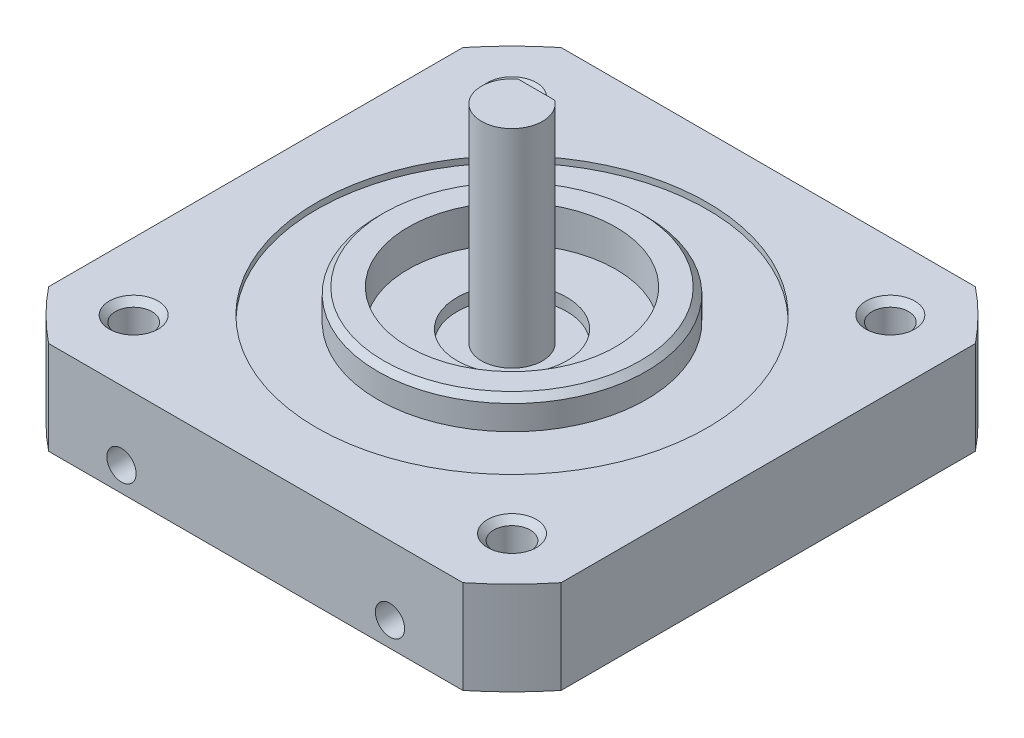
ISO-10303-21;
HEADER;
FILE_DESCRIPTION(('STEP AP214'),'2;1');
FILE_NAME('part.step','',(''),(''),'','','');
FILE_SCHEMA(('AUTOMOTIVE_DESIGN { 1 0 10303 214 1 1 1 1 }'));
ENDSEC;
DATA;
#1=APPLICATION_CONTEXT('core data for automotive mechanical design processes');
#2=APPLICATION_PROTOCOL_DEFINITION('international standard','automotive_design',2000,#1);
#3=PRODUCT_CONTEXT('',#1,'mechanical');
#4=PRODUCT('Part','Part','',(#3));
#5=PRODUCT_RELATED_PRODUCT_CATEGORY('part','',(#4));
#6=PRODUCT_DEFINITION_FORMATION('','',#4);
#7=PRODUCT_DEFINITION_CONTEXT('part definition',#1,'design');
#8=PRODUCT_DEFINITION('design','',#6,#7);
#9=PRODUCT_DEFINITION_SHAPE('','',#8);
#10=(LENGTH_UNIT() NAMED_UNIT(*) SI_UNIT(.MILLI.,.METRE.));
#11=(NAMED_UNIT(*) PLANE_ANGLE_UNIT() SI_UNIT($,.RADIAN.));
#12=(NAMED_UNIT(*) SI_UNIT($,.STERADIAN.) SOLID_ANGLE_UNIT());
#13=UNCERTAINTY_MEASURE_WITH_UNIT(LENGTH_MEASURE(1.E-05),#10,'distance_accuracy_value','');
#14=(GEOMETRIC_REPRESENTATION_CONTEXT(3) GLOBAL_UNCERTAINTY_ASSIGNED_CONTEXT((#13)) GLOBAL_UNIT_ASSIGNED_CONTEXT((#10,
#11,#12)) REPRESENTATION_CONTEXT('',''));
#15=CARTESIAN_POINT('',(0.,0.,0.));
#16=DIRECTION('',(0.,0.,1.));
#17=DIRECTION('',(1.,0.,0.));
#18=AXIS2_PLACEMENT_3D('',#15,#16,#17);
#19=CARTESIAN_POINT('',(17.6499999997864,29.3,17.65));
#20=DIRECTION('',(0.,1.,0.));
#21=DIRECTION('',(0.,0.,1.));
#22=AXIS2_PLACEMENT_3D('',#19,#20,#21);
#23=CYLINDRICAL_SURFACE('',#22,2.50000000020422);
#24=DIRECTION('',(0.,1.,0.));
#25=VECTOR('',#24,1.);
#26=CARTESIAN_POINT('',(19.1500000003991,40.3,15.6500000002042));
#27=LINE('',#26,#25);
#28=CARTESIAN_POINT('',(19.1500000003991,40.3,15.6500000002042));
#29=VERTEX_POINT('',#28);
#30=CARTESIAN_POINT('',(19.1500000003991,49.3,15.6500000002042));
#31=VERTEX_POINT('',#30);
#32=EDGE_CURVE('E123',#29,#31,#27,.T.);
#33=ORIENTED_EDGE('',*,*,#32,.T.);
#34=CARTESIAN_POINT('',(17.6499999997864,49.3,17.65));
#35=DIRECTION('',(0.,1.,0.));
#36=DIRECTION('',(0.,0.,1.));
#37=AXIS2_PLACEMENT_3D('',#34,#35,#36);
#38=CIRCLE('',#37,2.50000000020422);
#39=CARTESIAN_POINT('',(16.1499999991738,49.3,15.6500000002042));
#40=VERTEX_POINT('',#39);
#41=EDGE_CURVE('E139',#40,#31,#38,.T.);
#42=ORIENTED_EDGE('',*,*,#41,.F.);
#43=DIRECTION('',(0.,1.,0.));
#44=VECTOR('',#43,1.);
#45=CARTESIAN_POINT('',(16.1499999991738,40.3,15.6500000002042));
#46=LINE('',#45,#44);
#47=CARTESIAN_POINT('',(16.1499999991738,40.3,15.6500000002042));
#48=VERTEX_POINT('',#47);
#49=EDGE_CURVE('E58',#48,#40,#46,.T.);
#50=ORIENTED_EDGE('',*,*,#49,.F.);
#51=CARTESIAN_POINT('',(17.6499999997864,40.3,17.65));
#52=DIRECTION('',(0.,1.,0.));
#53=DIRECTION('',(0.,0.,1.));
#54=AXIS2_PLACEMENT_3D('',#51,#52,#53);
#55=CIRCLE('',#54,2.50000000020422);
#56=EDGE_CURVE('E129',#29,#48,#55,.T.);
#57=ORIENTED_EDGE('',*,*,#56,.F.);
#58=EDGE_LOOP('',(#33,#42,#50,#57));
#59=FACE_BOUND('',#58,.T.);
#60=CARTESIAN_POINT('',(17.6499999997864,32.3,17.65));
#61=DIRECTION('',(0.,1.,0.));
#62=DIRECTION('',(0.,0.,1.));
#63=AXIS2_PLACEMENT_3D('',#60,#61,#62);
#64=CIRCLE('',#63,2.50000000020422);
#65=CARTESIAN_POINT('',(17.6499999997864,32.3,20.1500000002042));
#66=VERTEX_POINT('',#65);
#67=EDGE_CURVE('E45',#66,#66,#64,.F.);
#68=ORIENTED_EDGE('',*,*,#67,.F.);
#69=EDGE_LOOP('',(#68));
#70=FACE_BOUND('',#69,.T.);
#71=ADVANCED_FACE('F42',(#59,#70),#23,.T.);
#72=CARTESIAN_POINT('',(17.6499999997864,32.3,17.65));
#73=DIRECTION('',(0.,1.,0.));
#74=DIRECTION('',(0.,0.,1.));
#75=AXIS2_PLACEMENT_3D('',#72,#73,#74);
#76=PLANE('',#75);
#77=CARTESIAN_POINT('',(17.6499999997864,32.3,17.65));
#78=DIRECTION('',(0.,1.,0.));
#79=DIRECTION('',(0.,0.,1.));
#80=AXIS2_PLACEMENT_3D('',#77,#78,#79);
#81=CIRCLE('',#80,4.5);
#82=CARTESIAN_POINT('',(17.6499999997864,32.3,22.15));
#83=VERTEX_POINT('',#82);
#84=EDGE_CURVE('E144',#83,#83,#81,.T.);
#85=ORIENTED_EDGE('',*,*,#84,.T.);
#86=EDGE_LOOP('',(#85));
#87=FACE_BOUND('',#86,.T.);
#88=ORIENTED_EDGE('',*,*,#67,.T.);
#89=EDGE_LOOP('',(#88));
#90=FACE_BOUND('',#89,.T.);
#91=ADVANCED_FACE('F265',(#87,#90),#76,.T.);
#92=CARTESIAN_POINT('',(17.6499999997864,32.3,17.65));
#93=DIRECTION('',(0.,1.,0.));
#94=DIRECTION('',(0.,0.,1.));
#95=AXIS2_PLACEMENT_3D('',#92,#93,#94);
#96=CYLINDRICAL_SURFACE('',#95,4.5);
#97=ORIENTED_EDGE('',*,*,#84,.F.);
#98=EDGE_LOOP('',(#97));
#99=FACE_BOUND('',#98,.T.);
#100=CARTESIAN_POINT('',(17.6499999997864,33.31,17.65));
#101=DIRECTION('',(0.,1.,0.));
#102=DIRECTION('',(0.,0.,1.));
#103=AXIS2_PLACEMENT_3D('',#100,#101,#102);
#104=CIRCLE('',#103,4.5);
#105=CARTESIAN_POINT('',(17.6499999997864,33.31,22.15));
#106=VERTEX_POINT('',#105);
#107=EDGE_CURVE('E260',#106,#106,#104,.F.);
#108=ORIENTED_EDGE('',*,*,#107,.F.);
#109=EDGE_LOOP('',(#108));
#110=FACE_BOUND('',#109,.T.);
#111=ADVANCED_FACE('F268',(#99,#110),#96,.F.);
#112=CARTESIAN_POINT('',(17.6499999997864,33.31,17.65));
#113=DIRECTION('',(0.,1.,0.));
#114=DIRECTION('',(0.,0.,1.));
#115=AXIS2_PLACEMENT_3D('',#112,#113,#114);
#116=PLANE('',#115);
#117=ORIENTED_EDGE('',*,*,#107,.T.);
#118=EDGE_LOOP('',(#117));
#119=FACE_BOUND('',#118,.T.);
#120=CARTESIAN_POINT('',(17.6499999997864,33.31,17.65));
#121=DIRECTION('',(0.,1.,0.));
#122=DIRECTION('',(0.,0.,1.));
#123=AXIS2_PLACEMENT_3D('',#120,#121,#122);
#124=CIRCLE('',#123,8.5);
#125=CARTESIAN_POINT('',(17.6499999997864,33.31,26.15));
#126=VERTEX_POINT('',#125);
#127=EDGE_CURVE('E257',#126,#126,#124,.T.);
#128=ORIENTED_EDGE('',*,*,#127,.T.);
#129=EDGE_LOOP('',(#128));
#130=FACE_BOUND('',#129,.T.);
#131=ADVANCED_FACE('F271',(#119,#130),#116,.T.);
#132=CARTESIAN_POINT('',(17.6499999997864,33.31,17.65));
#133=DIRECTION('',(0.,1.,0.));
#134=DIRECTION('',(0.,0.,1.));
#135=AXIS2_PLACEMENT_3D('',#132,#133,#134);
#136=CYLINDRICAL_SURFACE('',#135,8.5);
#137=CARTESIAN_POINT('',(17.6499999997864,36.3,17.65));
#138=DIRECTION('',(0.,1.,0.));
#139=DIRECTION('',(0.,0.,1.));
#140=AXIS2_PLACEMENT_3D('',#137,#138,#139);
#141=CIRCLE('',#140,8.5);
#142=CARTESIAN_POINT('',(17.6499999997864,36.3,26.15));
#143=VERTEX_POINT('',#142);
#144=EDGE_CURVE('E254',#143,#143,#141,.F.);
#145=ORIENTED_EDGE('',*,*,#144,.F.);
#146=EDGE_LOOP('',(#145));
#147=FACE_BOUND('',#146,.T.);
#148=ORIENTED_EDGE('',*,*,#127,.F.);
#149=EDGE_LOOP('',(#148));
#150=FACE_BOUND('',#149,.T.);
#151=ADVANCED_FACE('F277',(#147,#150),#136,.F.);
#152=CARTESIAN_POINT('',(17.6499999997864,36.3,17.65));
#153=DIRECTION('',(0.,1.,0.));
#154=DIRECTION('',(0.,0.,1.));
#155=AXIS2_PLACEMENT_3D('',#152,#153,#154);
#156=PLANE('',#155);
#157=ORIENTED_EDGE('',*,*,#144,.T.);
#158=EDGE_LOOP('',(#157));
#159=FACE_BOUND('',#158,.T.);
#160=CARTESIAN_POINT('',(17.6499999997864,36.3,17.65));
#161=DIRECTION('',(0.,-1.,0.));
#162=DIRECTION('',(0.,0.,-1.));
#163=AXIS2_PLACEMENT_3D('',#160,#161,#162);
#164=CIRCLE('',#163,10.5000000002042);
#165=CARTESIAN_POINT('',(17.6499999997864,36.3,7.14999999979579));
#166=VERTEX_POINT('',#165);
#167=EDGE_CURVE('E209',#166,#166,#164,.T.);
#168=ORIENTED_EDGE('',*,*,#167,.F.);
#169=EDGE_LOOP('',(#168));
#170=FACE_BOUND('',#169,.T.);
#171=ADVANCED_FACE('F282',(#159,#170),#156,.T.);
#172=CARTESIAN_POINT('',(17.6499999997864,35.8,17.65));
#173=DIRECTION('',(0.,-1.,0.));
#174=DIRECTION('',(0.,0.,-1.));
#175=AXIS2_PLACEMENT_3D('',#172,#173,#174);
#176=CONICAL_SURFACE('',#175,11.0000000002042,0.785398163397455);
#177=CARTESIAN_POINT('',(17.6499999997864,35.8,17.65));
#178=DIRECTION('',(0.,-1.,0.));
#179=DIRECTION('',(0.,0.,-1.));
#180=AXIS2_PLACEMENT_3D('',#177,#178,#179);
#181=CIRCLE('',#180,11.0000000002042);
#182=CARTESIAN_POINT('',(17.6499999997864,35.8,6.64999999979577));
#183=VERTEX_POINT('',#182);
#184=EDGE_CURVE('E206',#183,#183,#181,.T.);
#185=ORIENTED_EDGE('',*,*,#184,.F.);
#186=EDGE_LOOP('',(#185));
#187=FACE_BOUND('',#186,.T.);
#188=ORIENTED_EDGE('',*,*,#167,.T.);
#189=EDGE_LOOP('',(#188));
#190=FACE_BOUND('',#189,.T.);
#191=ADVANCED_FACE('F288',(#187,#190),#176,.T.);
#192=CARTESIAN_POINT('',(17.6499999997864,36.3,17.65));
#193=DIRECTION('',(0.,-1.,0.));
#194=DIRECTION('',(0.,0.,-1.));
#195=AXIS2_PLACEMENT_3D('',#192,#193,#194);
#196=CYLINDRICAL_SURFACE('',#195,11.0000000002042);
#197=CARTESIAN_POINT('',(17.6499999997864,33.8,17.65));
#198=DIRECTION('',(0.,-1.,0.));
#199=DIRECTION('',(0.,0.,-1.));
#200=AXIS2_PLACEMENT_3D('',#197,#198,#199);
#201=CIRCLE('',#200,11.0000000002042);
#202=CARTESIAN_POINT('',(17.6499999997864,33.8,6.64999999979577));
#203=VERTEX_POINT('',#202);
#204=EDGE_CURVE('E208',#203,#203,#201,.T.);
#205=ORIENTED_EDGE('',*,*,#204,.F.);
#206=EDGE_LOOP('',(#205));
#207=FACE_BOUND('',#206,.T.);
#208=ORIENTED_EDGE('',*,*,#184,.T.);
#209=EDGE_LOOP('',(#208));
#210=FACE_BOUND('',#209,.T.);
#211=ADVANCED_FACE('F396',(#207,#210),#196,.T.);
#212=CARTESIAN_POINT('',(2.14999999978644,29.8,33.15));
#213=DIRECTION('',(0.,-1.,0.));
#214=DIRECTION('',(0.,0.,-1.));
#215=AXIS2_PLACEMENT_3D('',#212,#213,#214);
#216=PLANE('',#215);
#217=CARTESIAN_POINT('',(2.14999999978644,29.8,33.15));
#218=DIRECTION('',(0.,1.,0.));
#219=DIRECTION('',(0.,0.,1.));
#220=AXIS2_PLACEMENT_3D('',#217,#218,#219);
#221=CIRCLE('',#220,1.5);
#222=CARTESIAN_POINT('',(2.14999999978644,29.8,34.65));
#223=VERTEX_POINT('',#222);
#224=EDGE_CURVE('E247',#223,#223,#221,.T.);
#225=ORIENTED_EDGE('',*,*,#224,.T.);
#226=EDGE_LOOP('',(#225));
#227=FACE_BOUND('',#226,.T.);
#228=ADVANCED_FACE('F392',(#227),#216,.F.);
#229=CARTESIAN_POINT('',(33.1499999997864,29.8,33.15));
#230=DIRECTION('',(0.,1.,0.));
#231=DIRECTION('',(0.,0.,1.));
#232=AXIS2_PLACEMENT_3D('',#229,#230,#231);
#233=PLANE('',#232);
#234=CARTESIAN_POINT('',(33.1499999997864,29.8,33.15));
#235=DIRECTION('',(0.,1.,0.));
#236=DIRECTION('',(0.,0.,1.));
#237=AXIS2_PLACEMENT_3D('',#234,#235,#236);
#238=CIRCLE('',#237,1.5);
#239=CARTESIAN_POINT('',(33.1499999997864,29.8,34.65));
#240=VERTEX_POINT('',#239);
#241=EDGE_CURVE('E244',#240,#240,#238,.T.);
#242=ORIENTED_EDGE('',*,*,#241,.T.);
#243=EDGE_LOOP('',(#242));
#244=FACE_BOUND('',#243,.T.);
#245=ADVANCED_FACE('F388',(#244),#233,.T.);
#246=CARTESIAN_POINT('',(33.1499999997864,29.8,2.15));
#247=DIRECTION('',(0.,-1.,0.));
#248=DIRECTION('',(0.,0.,-1.));
#249=AXIS2_PLACEMENT_3D('',#246,#247,#248);
#250=PLANE('',#249);
#251=CARTESIAN_POINT('',(33.1499999997864,29.8,2.15));
#252=DIRECTION('',(0.,1.,0.));
#253=DIRECTION('',(0.,0.,1.));
#254=AXIS2_PLACEMENT_3D('',#251,#252,#253);
#255=CIRCLE('',#254,1.5);
#256=CARTESIAN_POINT('',(33.1499999997864,29.8,3.65));
#257=VERTEX_POINT('',#256);
#258=EDGE_CURVE('E241',#257,#257,#255,.T.);
#259=ORIENTED_EDGE('',*,*,#258,.T.);
#260=EDGE_LOOP('',(#259));
#261=FACE_BOUND('',#260,.T.);
#262=ADVANCED_FACE('F384',(#261),#250,.F.);
#263=CARTESIAN_POINT('',(2.14999999978644,29.8,2.15));
#264=DIRECTION('',(0.,1.,0.));
#265=DIRECTION('',(0.,0.,1.));
#266=AXIS2_PLACEMENT_3D('',#263,#264,#265);
#267=PLANE('',#266);
#268=CARTESIAN_POINT('',(2.14999999978644,29.8,2.15));
#269=DIRECTION('',(0.,1.,0.));
#270=DIRECTION('',(0.,0.,1.));
#271=AXIS2_PLACEMENT_3D('',#268,#269,#270);
#272=CIRCLE('',#271,1.5);
#273=CARTESIAN_POINT('',(2.14999999978644,29.8,3.65));
#274=VERTEX_POINT('',#273);
#275=EDGE_CURVE('E238',#274,#274,#272,.T.);
#276=ORIENTED_EDGE('',*,*,#275,.T.);
#277=EDGE_LOOP('',(#276));
#278=FACE_BOUND('',#277,.T.);
#279=ADVANCED_FACE('F380',(#278),#267,.T.);
#280=CARTESIAN_POINT('',(17.6499999997864,33.8,17.65));
#281=DIRECTION('',(0.,1.,0.));
#282=DIRECTION('',(0.,0.,1.));
#283=AXIS2_PLACEMENT_3D('',#280,#281,#282);
#284=PLANE('',#283);
#285=CARTESIAN_POINT('',(17.6499999997864,33.8,17.65));
#286=DIRECTION('',(0.,1.,0.));
#287=DIRECTION('',(0.,0.,1.));
#288=AXIS2_PLACEMENT_3D('',#285,#286,#287);
#289=CIRCLE('',#288,16.);
#290=CARTESIAN_POINT('',(17.6499999997864,33.8,33.65));
#291=VERTEX_POINT('',#290);
#292=EDGE_CURVE('E205',#291,#291,#289,.T.);
#293=ORIENTED_EDGE('',*,*,#292,.T.);
#294=EDGE_LOOP('',(#293));
#295=FACE_BOUND('',#294,.T.);
#296=ORIENTED_EDGE('',*,*,#204,.T.);
#297=EDGE_LOOP('',(#296));
#298=FACE_BOUND('',#297,.T.);
#299=ADVANCED_FACE('F376',(#295,#298),#284,.T.);
#300=CARTESIAN_POINT('',(2.14999999978644,29.8,33.15));
#301=DIRECTION('',(0.,1.,0.));
#302=DIRECTION('',(0.,0.,1.));
#303=AXIS2_PLACEMENT_3D('',#300,#301,#302);
#304=CYLINDRICAL_SURFACE('',#303,1.5);
#305=ORIENTED_EDGE('',*,*,#224,.F.);
#306=EDGE_LOOP('',(#305));
#307=FACE_BOUND('',#306,.T.);
#308=CARTESIAN_POINT('',(2.14999999978644,33.7999999999852,33.15));
#309=DIRECTION('',(0.,1.,0.));
#310=DIRECTION('',(0.,0.,1.));
#311=AXIS2_PLACEMENT_3D('',#308,#309,#310);
#312=CIRCLE('',#311,1.49999999999918);
#313=CARTESIAN_POINT('',(2.14999999978644,33.7999999999852,34.6499999999992));
#314=VERTEX_POINT('',#313);
#315=EDGE_CURVE('E202',#314,#314,#312,.T.);
#316=ORIENTED_EDGE('',*,*,#315,.T.);
#317=EDGE_LOOP('',(#316));
#318=FACE_BOUND('',#317,.T.);
#319=ADVANCED_FACE('F372',(#307,#318),#304,.F.);
#320=CARTESIAN_POINT('',(33.1499999997864,29.8,33.15));
#321=DIRECTION('',(0.,1.,0.));
#322=DIRECTION('',(0.,0.,1.));
#323=AXIS2_PLACEMENT_3D('',#320,#321,#322);
#324=CYLINDRICAL_SURFACE('',#323,1.5);
#325=ORIENTED_EDGE('',*,*,#241,.F.);
#326=EDGE_LOOP('',(#325));
#327=FACE_BOUND('',#326,.T.);
#328=CARTESIAN_POINT('',(33.1499999997864,33.7999999999852,33.15));
#329=DIRECTION('',(0.,1.,0.));
#330=DIRECTION('',(0.,0.,1.));
#331=AXIS2_PLACEMENT_3D('',#328,#329,#330);
#332=CIRCLE('',#331,1.49999999999918);
#333=CARTESIAN_POINT('',(33.1499999997864,33.7999999999852,34.6499999999992));
#334=VERTEX_POINT('',#333);
#335=EDGE_CURVE('E199',#334,#334,#332,.T.);
#336=ORIENTED_EDGE('',*,*,#335,.T.);
#337=EDGE_LOOP('',(#336));
#338=FACE_BOUND('',#337,.T.);
#339=ADVANCED_FACE('F368',(#327,#338),#324,.F.);
#340=CARTESIAN_POINT('',(33.1499999997864,29.8,2.15));
#341=DIRECTION('',(0.,1.,0.));
#342=DIRECTION('',(0.,0.,1.));
#343=AXIS2_PLACEMENT_3D('',#340,#341,#342);
#344=CYLINDRICAL_SURFACE('',#343,1.5);
#345=ORIENTED_EDGE('',*,*,#258,.F.);
#346=EDGE_LOOP('',(#345));
#347=FACE_BOUND('',#346,.T.);
#348=CARTESIAN_POINT('',(33.1499999997864,33.800000000042,2.15));
#349=DIRECTION('',(0.,1.,0.));
#350=DIRECTION('',(0.,0.,1.));
#351=AXIS2_PLACEMENT_3D('',#348,#349,#350);
#352=CIRCLE('',#351,1.49999999999327);
#353=CARTESIAN_POINT('',(33.1499999997864,33.800000000042,3.64999999999327));
#354=VERTEX_POINT('',#353);
#355=EDGE_CURVE('E196',#354,#354,#352,.T.);
#356=ORIENTED_EDGE('',*,*,#355,.T.);
#357=EDGE_LOOP('',(#356));
#358=FACE_BOUND('',#357,.T.);
#359=ADVANCED_FACE('F364',(#347,#358),#344,.F.);
#360=CARTESIAN_POINT('',(2.14999999978644,29.8,2.15));
#361=DIRECTION('',(0.,1.,0.));
#362=DIRECTION('',(0.,0.,1.));
#363=AXIS2_PLACEMENT_3D('',#360,#361,#362);
#364=CYLINDRICAL_SURFACE('',#363,1.5);
#365=ORIENTED_EDGE('',*,*,#275,.F.);
#366=EDGE_LOOP('',(#365));
#367=FACE_BOUND('',#366,.T.);
#368=CARTESIAN_POINT('',(2.14999999978644,33.7999999999852,2.15));
#369=DIRECTION('',(0.,1.,0.));
#370=DIRECTION('',(0.,0.,1.));
#371=AXIS2_PLACEMENT_3D('',#368,#369,#370);
#372=CIRCLE('',#371,1.49999999999327);
#373=CARTESIAN_POINT('',(2.14999999978644,33.7999999999852,3.64999999999327));
#374=VERTEX_POINT('',#373);
#375=EDGE_CURVE('E192',#374,#374,#372,.T.);
#376=ORIENTED_EDGE('',*,*,#375,.T.);
#377=EDGE_LOOP('',(#376));
#378=FACE_BOUND('',#377,.T.);
#379=ADVANCED_FACE('F360',(#367,#378),#364,.F.);
#380=CARTESIAN_POINT('',(17.6499999997864,33.8,17.65));
#381=DIRECTION('',(0.,1.,0.));
#382=DIRECTION('',(0.,0.,1.));
#383=AXIS2_PLACEMENT_3D('',#380,#381,#382);
#384=CYLINDRICAL_SURFACE('',#383,16.);
#385=CARTESIAN_POINT('',(17.6499999997864,34.3,17.65));
#386=DIRECTION('',(0.,1.,0.));
#387=DIRECTION('',(0.,0.,1.));
#388=AXIS2_PLACEMENT_3D('',#385,#386,#387);
#389=CIRCLE('',#388,16.);
#390=CARTESIAN_POINT('',(17.6499999997864,34.3,33.65));
#391=VERTEX_POINT('',#390);
#392=EDGE_CURVE('E195',#391,#391,#389,.F.);
#393=ORIENTED_EDGE('',*,*,#392,.F.);
#394=EDGE_LOOP('',(#393));
#395=FACE_BOUND('',#394,.T.);
#396=ORIENTED_EDGE('',*,*,#292,.F.);
#397=EDGE_LOOP('',(#396));
#398=FACE_BOUND('',#397,.T.);
#399=ADVANCED_FACE('F356',(#395,#398),#384,.F.);
#400=CARTESIAN_POINT('',(2.14999999978644,34.2999999998597,33.15));
#401=DIRECTION('',(0.,1.,0.));
#402=DIRECTION('',(0.,0.,1.));
#403=AXIS2_PLACEMENT_3D('',#400,#401,#402);
#404=CONICAL_SURFACE('',#403,1.99999999987367,0.785398163397448);
#405=ORIENTED_EDGE('',*,*,#315,.F.);
#406=EDGE_LOOP('',(#405));
#407=FACE_BOUND('',#406,.T.);
#408=CARTESIAN_POINT('',(2.14999999978644,34.2999999999734,33.15));
#409=DIRECTION('',(0.,1.,0.));
#410=DIRECTION('',(0.,0.,1.));
#411=AXIS2_PLACEMENT_3D('',#408,#409,#410);
#412=CIRCLE('',#411,1.99999999998736);
#413=CARTESIAN_POINT('',(2.14999999978644,34.2999999999734,35.1499999999874));
#414=VERTEX_POINT('',#413);
#415=EDGE_CURVE('E231',#414,#414,#412,.F.);
#416=ORIENTED_EDGE('',*,*,#415,.F.);
#417=EDGE_LOOP('',(#416));
#418=FACE_BOUND('',#417,.T.);
#419=ADVANCED_FACE('F352',(#407,#418),#404,.F.);
#420=CARTESIAN_POINT('',(33.1499999997864,34.2999999998597,33.15));
#421=DIRECTION('',(0.,1.,0.));
#422=DIRECTION('',(0.,0.,1.));
#423=AXIS2_PLACEMENT_3D('',#420,#421,#422);
#424=CONICAL_SURFACE('',#423,1.99999999987367,0.785398163397448);
#425=ORIENTED_EDGE('',*,*,#335,.F.);
#426=EDGE_LOOP('',(#425));
#427=FACE_BOUND('',#426,.T.);
#428=CARTESIAN_POINT('',(33.1499999997864,34.2999999999734,33.15));
#429=DIRECTION('',(0.,1.,0.));
#430=DIRECTION('',(0.,0.,1.));
#431=AXIS2_PLACEMENT_3D('',#428,#429,#430);
#432=CIRCLE('',#431,1.99999999998736);
#433=CARTESIAN_POINT('',(33.1499999997864,34.2999999999734,35.1499999999874));
#434=VERTEX_POINT('',#433);
#435=EDGE_CURVE('E228',#434,#434,#432,.F.);
#436=ORIENTED_EDGE('',*,*,#435,.F.);
#437=EDGE_LOOP('',(#436));
#438=FACE_BOUND('',#437,.T.);
#439=ADVANCED_FACE('F348',(#427,#438),#424,.F.);
#440=CARTESIAN_POINT('',(33.1499999997864,34.2999999999734,2.15));
#441=DIRECTION('',(0.,1.,0.));
#442=DIRECTION('',(0.,0.,1.));
#443=AXIS2_PLACEMENT_3D('',#440,#441,#442);
#444=CONICAL_SURFACE('',#443,1.9999999999246,0.785398163454292);
#445=ORIENTED_EDGE('',*,*,#355,.F.);
#446=EDGE_LOOP('',(#445));
#447=FACE_BOUND('',#446,.T.);
#448=CARTESIAN_POINT('',(33.1499999997864,34.3000000000015,2.15));
#449=DIRECTION('',(0.,1.,0.));
#450=DIRECTION('',(0.,0.,1.));
#451=AXIS2_PLACEMENT_3D('',#448,#449,#450);
#452=CIRCLE('',#451,1.99999999995271);
#453=CARTESIAN_POINT('',(33.1499999997864,34.3000000000015,4.14999999995271));
#454=VERTEX_POINT('',#453);
#455=EDGE_CURVE('E225',#454,#454,#452,.F.);
#456=ORIENTED_EDGE('',*,*,#455,.F.);
#457=EDGE_LOOP('',(#456));
#458=FACE_BOUND('',#457,.T.);
#459=ADVANCED_FACE('F344',(#447,#458),#444,.F.);
#460=CARTESIAN_POINT('',(2.14999999978644,34.2999999999165,2.15));
#461=DIRECTION('',(0.,1.,0.));
#462=DIRECTION('',(0.,0.,1.));
#463=AXIS2_PLACEMENT_3D('',#460,#461,#462);
#464=CONICAL_SURFACE('',#463,1.9999999999246,0.785398163397448);
#465=ORIENTED_EDGE('',*,*,#375,.F.);
#466=EDGE_LOOP('',(#465));
#467=FACE_BOUND('',#466,.T.);
#468=CARTESIAN_POINT('',(2.14999999978644,34.3000000000302,2.15));
#469=DIRECTION('',(0.,1.,0.));
#470=DIRECTION('',(0.,0.,1.));
#471=AXIS2_PLACEMENT_3D('',#468,#469,#470);
#472=CIRCLE('',#471,2.00000000003829);
#473=CARTESIAN_POINT('',(2.14999999978644,34.3000000000302,4.15000000003829));
#474=VERTEX_POINT('',#473);
#475=EDGE_CURVE('E188',#474,#474,#472,.F.);
#476=ORIENTED_EDGE('',*,*,#475,.F.);
#477=EDGE_LOOP('',(#476));
#478=FACE_BOUND('',#477,.T.);
#479=ADVANCED_FACE('F341',(#467,#478),#464,.F.);
#480=CARTESIAN_POINT('',(17.6499999997864,34.3,17.65));
#481=DIRECTION('',(0.,1.,0.));
#482=DIRECTION('',(0.,0.,1.));
#483=AXIS2_PLACEMENT_3D('',#480,#481,#482);
#484=PLANE('',#483);
#485=CARTESIAN_POINT('',(17.6499999997864,34.3,17.65));
#486=DIRECTION('',(0.,-1.,0.));
#487=DIRECTION('',(0.,0.,-1.));
#488=AXIS2_PLACEMENT_3D('',#485,#486,#487);
#489=CIRCLE('',#488,27.);
#490=CARTESIAN_POINT('',(34.6205627482636,34.3,-3.35000000000001));
#491=VERTEX_POINT('',#490);
#492=CARTESIAN_POINT('',(38.6499999997864,34.3,0.679437251522847));
#493=VERTEX_POINT('',#492);
#494=EDGE_CURVE('E179',#491,#493,#489,.T.);
#495=ORIENTED_EDGE('',*,*,#494,.F.);
#496=DIRECTION('',(1.,0.,0.));
#497=VECTOR('',#496,1.);
#498=CARTESIAN_POINT('',(0.679437251309294,34.3,-3.35));
#499=LINE('',#498,#497);
#500=CARTESIAN_POINT('',(0.679437251309289,34.3,-3.34999999999999));
#501=VERTEX_POINT('',#500);
#502=EDGE_CURVE('E176',#491,#501,#499,.F.);
#503=ORIENTED_EDGE('',*,*,#502,.T.);
#504=CARTESIAN_POINT('',(17.6499999997864,34.3,17.65));
#505=DIRECTION('',(0.,-1.,0.));
#506=DIRECTION('',(0.,0.,-1.));
#507=AXIS2_PLACEMENT_3D('',#504,#505,#506);
#508=CIRCLE('',#507,27.);
#509=CARTESIAN_POINT('',(-3.35000000021357,34.3,0.67943725152287));
#510=VERTEX_POINT('',#509);
#511=EDGE_CURVE('E172',#510,#501,#508,.T.);
#512=ORIENTED_EDGE('',*,*,#511,.F.);
#513=DIRECTION('',(0.,0.,-1.));
#514=VECTOR('',#513,1.);
#515=CARTESIAN_POINT('',(-3.35000000021357,34.3,0.67943725152287));
#516=LINE('',#515,#514);
#517=CARTESIAN_POINT('',(-3.35000000021355,34.3,34.6205627484771));
#518=VERTEX_POINT('',#517);
#519=EDGE_CURVE('E169',#510,#518,#516,.F.);
#520=ORIENTED_EDGE('',*,*,#519,.T.);
#521=CARTESIAN_POINT('',(17.6499999997864,34.3,17.65));
#522=DIRECTION('',(0.,-1.,0.));
#523=DIRECTION('',(0.,0.,-1.));
#524=AXIS2_PLACEMENT_3D('',#521,#522,#523);
#525=CIRCLE('',#524,27.);
#526=CARTESIAN_POINT('',(0.679437251309306,34.3,38.65));
#527=VERTEX_POINT('',#526);
#528=EDGE_CURVE('E161',#527,#518,#525,.T.);
#529=ORIENTED_EDGE('',*,*,#528,.F.);
#530=DIRECTION('',(-1.,0.,0.));
#531=VECTOR('',#530,1.);
#532=CARTESIAN_POINT('',(0.679437251309305,34.3,38.65));
#533=LINE('',#532,#531);
#534=CARTESIAN_POINT('',(34.6205627482636,34.3,38.65));
#535=VERTEX_POINT('',#534);
#536=EDGE_CURVE('E118',#527,#535,#533,.F.);
#537=ORIENTED_EDGE('',*,*,#536,.T.);
#538=CARTESIAN_POINT('',(17.6499999997864,34.3,17.65));
#539=DIRECTION('',(0.,-1.,0.));
#540=DIRECTION('',(0.,0.,-1.));
#541=AXIS2_PLACEMENT_3D('',#538,#539,#540);
#542=CIRCLE('',#541,27.);
#543=CARTESIAN_POINT('',(38.6499999997864,34.3,34.6205627484771));
#544=VERTEX_POINT('',#543);
#545=EDGE_CURVE('E186',#544,#535,#542,.T.);
#546=ORIENTED_EDGE('',*,*,#545,.F.);
#547=DIRECTION('',(0.,0.,1.));
#548=VECTOR('',#547,1.);
#549=CARTESIAN_POINT('',(38.6499999997864,34.3,0.679437251522842));
#550=LINE('',#549,#548);
#551=EDGE_CURVE('E183',#544,#493,#550,.F.);
#552=ORIENTED_EDGE('',*,*,#551,.T.);
#553=EDGE_LOOP('',(#495,#503,#512,#520,#529,#537,#546,#552));
#554=FACE_BOUND('',#553,.T.);
#555=ORIENTED_EDGE('',*,*,#475,.T.);
#556=EDGE_LOOP('',(#555));
#557=FACE_BOUND('',#556,.T.);
#558=ORIENTED_EDGE('',*,*,#455,.T.);
#559=EDGE_LOOP('',(#558));
#560=FACE_BOUND('',#559,.T.);
#561=ORIENTED_EDGE('',*,*,#435,.T.);
#562=EDGE_LOOP('',(#561));
#563=FACE_BOUND('',#562,.T.);
#564=ORIENTED_EDGE('',*,*,#415,.T.);
#565=EDGE_LOOP('',(#564));
#566=FACE_BOUND('',#565,.T.);
#567=ORIENTED_EDGE('',*,*,#392,.T.);
#568=EDGE_LOOP('',(#567));
#569=FACE_BOUND('',#568,.T.);
#570=ADVANCED_FACE('F337',(#554,#557,#560,#563,#566,#569),#484,.T.);
#571=CARTESIAN_POINT('',(0.679437251309305,34.3,38.65));
#572=DIRECTION('',(0.,0.,-1.));
#573=DIRECTION('',(-1.,0.,0.));
#574=AXIS2_PLACEMENT_3D('',#571,#572,#573);
#575=PLANE('',#574);
#576=CARTESIAN_POINT('',(6.64999999978646,28.65,38.65));
#577=DIRECTION('',(0.,0.,1.));
#578=DIRECTION('',(1.,0.,0.));
#579=AXIS2_PLACEMENT_3D('',#576,#577,#578);
#580=CIRCLE('',#579,1.2);
#581=CARTESIAN_POINT('',(7.84999999978645,28.65,38.65));
#582=VERTEX_POINT('',#581);
#583=EDGE_CURVE('E744',#582,#582,#580,.T.);
#584=ORIENTED_EDGE('',*,*,#583,.F.);
#585=EDGE_LOOP('',(#584));
#586=FACE_BOUND('',#585,.T.);
#587=CARTESIAN_POINT('',(28.6499999997865,28.65,38.65));
#588=DIRECTION('',(0.,0.,1.));
#589=DIRECTION('',(1.,0.,0.));
#590=AXIS2_PLACEMENT_3D('',#587,#588,#589);
#591=CIRCLE('',#590,1.2);
#592=CARTESIAN_POINT('',(29.8499999997865,28.65,38.65));
#593=VERTEX_POINT('',#592);
#594=EDGE_CURVE('E738',#593,#593,#591,.T.);
#595=ORIENTED_EDGE('',*,*,#594,.F.);
#596=EDGE_LOOP('',(#595));
#597=FACE_BOUND('',#596,.T.);
#598=DIRECTION('',(1.,0.,0.));
#599=VECTOR('',#598,1.);
#600=CARTESIAN_POINT('',(38.6499999997864,26.65,38.65));
#601=LINE('',#600,#599);
#602=CARTESIAN_POINT('',(0.679437251309306,26.65,38.65));
#603=VERTEX_POINT('',#602);
#604=CARTESIAN_POINT('',(34.6205627482636,26.65,38.65));
#605=VERTEX_POINT('',#604);
#606=EDGE_CURVE('E158',#603,#605,#601,.T.);
#607=ORIENTED_EDGE('',*,*,#606,.T.);
#608=DIRECTION('',(0.,-1.,0.));
#609=VECTOR('',#608,1.);
#610=CARTESIAN_POINT('',(34.6205627482636,34.3,38.65));
#611=LINE('',#610,#609);
#612=EDGE_CURVE('E184',#535,#605,#611,.T.);
#613=ORIENTED_EDGE('',*,*,#612,.F.);
#614=ORIENTED_EDGE('',*,*,#536,.F.);
#615=DIRECTION('',(0.,-1.,0.));
#616=VECTOR('',#615,1.);
#617=CARTESIAN_POINT('',(0.679437251309308,34.3,38.65));
#618=LINE('',#617,#616);
#619=EDGE_CURVE('E163',#603,#527,#618,.F.);
#620=ORIENTED_EDGE('',*,*,#619,.F.);
#621=EDGE_LOOP('',(#607,#613,#614,#620));
#622=FACE_BOUND('',#621,.T.);
#623=ADVANCED_FACE('F333',(#586,#597,#622),#575,.F.);
#624=CARTESIAN_POINT('',(17.6499999997864,34.3,17.65));
#625=DIRECTION('',(0.,-1.,0.));
#626=DIRECTION('',(0.,0.,-1.));
#627=AXIS2_PLACEMENT_3D('',#624,#625,#626);
#628=CYLINDRICAL_SURFACE('',#627,27.);
#629=DIRECTION('',(0.,1.,0.));
#630=VECTOR('',#629,1.);
#631=CARTESIAN_POINT('',(38.6499999997864,34.3,34.6205627484771));
#632=LINE('',#631,#630);
#633=CARTESIAN_POINT('',(38.6499999997864,26.65,34.6205627484771));
#634=VERTEX_POINT('',#633);
#635=EDGE_CURVE('E180',#634,#544,#632,.T.);
#636=ORIENTED_EDGE('',*,*,#635,.T.);
#637=ORIENTED_EDGE('',*,*,#545,.T.);
#638=ORIENTED_EDGE('',*,*,#612,.T.);
#639=CARTESIAN_POINT('',(17.6499999997864,26.65,17.65));
#640=DIRECTION('',(0.,-1.,0.));
#641=DIRECTION('',(0.,0.,-1.));
#642=AXIS2_PLACEMENT_3D('',#639,#640,#641);
#643=CIRCLE('',#642,27.);
#644=EDGE_CURVE('E157',#605,#634,#643,.F.);
#645=ORIENTED_EDGE('',*,*,#644,.T.);
#646=EDGE_LOOP('',(#636,#637,#638,#645));
#647=FACE_BOUND('',#646,.T.);
#648=ADVANCED_FACE('F329',(#647),#628,.T.);
#649=CARTESIAN_POINT('',(38.6499999997864,34.3,0.679437251522842));
#650=DIRECTION('',(-1.,0.,0.));
#651=DIRECTION('',(0.,0.,1.));
#652=AXIS2_PLACEMENT_3D('',#649,#650,#651);
#653=PLANE('',#652);
#654=DIRECTION('',(0.,0.,1.));
#655=VECTOR('',#654,1.);
#656=CARTESIAN_POINT('',(38.6499999997864,26.65,-3.35));
#657=LINE('',#656,#655);
#658=CARTESIAN_POINT('',(38.6499999997864,26.65,0.679437251522854));
#659=VERTEX_POINT('',#658);
#660=EDGE_CURVE('E154',#634,#659,#657,.F.);
#661=ORIENTED_EDGE('',*,*,#660,.T.);
#662=DIRECTION('',(0.,-1.,0.));
#663=VECTOR('',#662,1.);
#664=CARTESIAN_POINT('',(38.6499999997864,34.3,0.679437251522842));
#665=LINE('',#664,#663);
#666=EDGE_CURVE('E177',#493,#659,#665,.T.);
#667=ORIENTED_EDGE('',*,*,#666,.F.);
#668=ORIENTED_EDGE('',*,*,#551,.F.);
#669=ORIENTED_EDGE('',*,*,#635,.F.);
#670=EDGE_LOOP('',(#661,#667,#668,#669));
#671=FACE_BOUND('',#670,.T.);
#672=ADVANCED_FACE('F325',(#671),#653,.F.);
#673=CARTESIAN_POINT('',(17.6499999997864,34.3,17.65));
#674=DIRECTION('',(0.,-1.,0.));
#675=DIRECTION('',(0.,0.,-1.));
#676=AXIS2_PLACEMENT_3D('',#673,#674,#675);
#677=CYLINDRICAL_SURFACE('',#676,27.);
#678=DIRECTION('',(0.,1.,0.));
#679=VECTOR('',#678,1.);
#680=CARTESIAN_POINT('',(34.6205627482636,34.3,-3.35000000000001));
#681=LINE('',#680,#679);
#682=CARTESIAN_POINT('',(34.6205627482636,26.65,-3.35));
#683=VERTEX_POINT('',#682);
#684=EDGE_CURVE('E173',#683,#491,#681,.T.);
#685=ORIENTED_EDGE('',*,*,#684,.T.);
#686=ORIENTED_EDGE('',*,*,#494,.T.);
#687=ORIENTED_EDGE('',*,*,#666,.T.);
#688=CARTESIAN_POINT('',(17.6499999997864,26.65,17.65));
#689=DIRECTION('',(0.,-1.,0.));
#690=DIRECTION('',(0.,0.,-1.));
#691=AXIS2_PLACEMENT_3D('',#688,#689,#690);
#692=CIRCLE('',#691,27.);
#693=EDGE_CURVE('E153',#659,#683,#692,.F.);
#694=ORIENTED_EDGE('',*,*,#693,.T.);
#695=EDGE_LOOP('',(#685,#686,#687,#694));
#696=FACE_BOUND('',#695,.T.);
#697=ADVANCED_FACE('F321',(#696),#677,.T.);
#698=CARTESIAN_POINT('',(0.679437251309294,34.3,-3.35));
#699=DIRECTION('',(0.,0.,1.));
#700=DIRECTION('',(1.,0.,0.));
#701=AXIS2_PLACEMENT_3D('',#698,#699,#700);
#702=PLANE('',#701);
#703=DIRECTION('',(1.,0.,0.));
#704=VECTOR('',#703,1.);
#705=CARTESIAN_POINT('',(38.6499999997864,26.65,-3.35));
#706=LINE('',#705,#704);
#707=CARTESIAN_POINT('',(0.679437251309289,26.65,-3.34999999999999));
#708=VERTEX_POINT('',#707);
#709=EDGE_CURVE('E150',#683,#708,#706,.F.);
#710=ORIENTED_EDGE('',*,*,#709,.T.);
#711=DIRECTION('',(0.,-1.,0.));
#712=VECTOR('',#711,1.);
#713=CARTESIAN_POINT('',(0.679437251309284,34.3,-3.34999999999999));
#714=LINE('',#713,#712);
#715=EDGE_CURVE('E170',#501,#708,#714,.T.);
#716=ORIENTED_EDGE('',*,*,#715,.F.);
#717=ORIENTED_EDGE('',*,*,#502,.F.);
#718=ORIENTED_EDGE('',*,*,#684,.F.);
#719=EDGE_LOOP('',(#710,#716,#717,#718));
#720=FACE_BOUND('',#719,.T.);
#721=ADVANCED_FACE('F317',(#720),#702,.F.);
#722=CARTESIAN_POINT('',(17.6499999997864,34.3,17.65));
#723=DIRECTION('',(0.,-1.,0.));
#724=DIRECTION('',(0.,0.,-1.));
#725=AXIS2_PLACEMENT_3D('',#722,#723,#724);
#726=CYLINDRICAL_SURFACE('',#725,27.);
#727=DIRECTION('',(0.,1.,0.));
#728=VECTOR('',#727,1.);
#729=CARTESIAN_POINT('',(-3.35000000021357,34.3,0.67943725152287));
#730=LINE('',#729,#728);
#731=CARTESIAN_POINT('',(-3.35000000021357,26.65,0.679437251522872));
#732=VERTEX_POINT('',#731);
#733=EDGE_CURVE('E164',#732,#510,#730,.T.);
#734=ORIENTED_EDGE('',*,*,#733,.T.);
#735=ORIENTED_EDGE('',*,*,#511,.T.);
#736=ORIENTED_EDGE('',*,*,#715,.T.);
#737=CARTESIAN_POINT('',(17.6499999997864,26.65,17.65));
#738=DIRECTION('',(0.,-1.,0.));
#739=DIRECTION('',(0.,0.,-1.));
#740=AXIS2_PLACEMENT_3D('',#737,#738,#739);
#741=CIRCLE('',#740,27.);
#742=EDGE_CURVE('E149',#708,#732,#741,.F.);
#743=ORIENTED_EDGE('',*,*,#742,.T.);
#744=EDGE_LOOP('',(#734,#735,#736,#743));
#745=FACE_BOUND('',#744,.T.);
#746=ADVANCED_FACE('F313',(#745),#726,.T.);
#747=CARTESIAN_POINT('',(-3.35000000021357,34.3,0.67943725152287));
#748=DIRECTION('',(1.,0.,0.));
#749=DIRECTION('',(0.,0.,-1.));
#750=AXIS2_PLACEMENT_3D('',#747,#748,#749);
#751=PLANE('',#750);
#752=CARTESIAN_POINT('',(-3.35000000021357,28.65,6.65));
#753=DIRECTION('',(-1.,0.,0.));
#754=DIRECTION('',(0.,0.,1.));
#755=AXIS2_PLACEMENT_3D('',#752,#753,#754);
#756=CIRCLE('',#755,1.2);
#757=CARTESIAN_POINT('',(-3.35000000021357,28.65,7.85));
#758=VERTEX_POINT('',#757);
#759=EDGE_CURVE('E729',#758,#758,#756,.T.);
#760=ORIENTED_EDGE('',*,*,#759,.F.);
#761=EDGE_LOOP('',(#760));
#762=FACE_BOUND('',#761,.T.);
#763=CARTESIAN_POINT('',(-3.35000000021356,28.65,28.65));
#764=DIRECTION('',(-1.,0.,0.));
#765=DIRECTION('',(0.,0.,1.));
#766=AXIS2_PLACEMENT_3D('',#763,#764,#765);
#767=CIRCLE('',#766,1.2);
#768=CARTESIAN_POINT('',(-3.35000000021356,28.65,29.85));
#769=VERTEX_POINT('',#768);
#770=EDGE_CURVE('E723',#769,#769,#767,.T.);
#771=ORIENTED_EDGE('',*,*,#770,.F.);
#772=EDGE_LOOP('',(#771));
#773=FACE_BOUND('',#772,.T.);
#774=DIRECTION('',(0.,0.,1.));
#775=VECTOR('',#774,1.);
#776=CARTESIAN_POINT('',(-3.35000000021357,26.65,-3.35));
#777=LINE('',#776,#775);
#778=CARTESIAN_POINT('',(-3.35000000021356,26.65,34.6205627484771));
#779=VERTEX_POINT('',#778);
#780=EDGE_CURVE('E50',#732,#779,#777,.T.);
#781=ORIENTED_EDGE('',*,*,#780,.T.);
#782=DIRECTION('',(0.,-1.,0.));
#783=VECTOR('',#782,1.);
#784=CARTESIAN_POINT('',(-3.35000000021356,34.3,34.6205627484771));
#785=LINE('',#784,#783);
#786=EDGE_CURVE('E66',#518,#779,#785,.T.);
#787=ORIENTED_EDGE('',*,*,#786,.F.);
#788=ORIENTED_EDGE('',*,*,#519,.F.);
#789=ORIENTED_EDGE('',*,*,#733,.F.);
#790=EDGE_LOOP('',(#781,#787,#788,#789));
#791=FACE_BOUND('',#790,.T.);
#792=ADVANCED_FACE('F306',(#762,#773,#791),#751,.F.);
#793=CARTESIAN_POINT('',(17.6499999997864,34.3,17.65));
#794=DIRECTION('',(0.,-1.,0.));
#795=DIRECTION('',(0.,0.,-1.));
#796=AXIS2_PLACEMENT_3D('',#793,#794,#795);
#797=CYLINDRICAL_SURFACE('',#796,27.);
#798=ORIENTED_EDGE('',*,*,#619,.T.);
#799=ORIENTED_EDGE('',*,*,#528,.T.);
#800=ORIENTED_EDGE('',*,*,#786,.T.);
#801=CARTESIAN_POINT('',(17.6499999997864,26.65,17.65));
#802=DIRECTION('',(0.,-1.,0.));
#803=DIRECTION('',(0.,0.,-1.));
#804=AXIS2_PLACEMENT_3D('',#801,#802,#803);
#805=CIRCLE('',#804,27.);
#806=EDGE_CURVE('E11',#779,#603,#805,.F.);
#807=ORIENTED_EDGE('',*,*,#806,.T.);
#808=EDGE_LOOP('',(#798,#799,#800,#807));
#809=FACE_BOUND('',#808,.T.);
#810=ADVANCED_FACE('F298',(#809),#797,.T.);
#811=CARTESIAN_POINT('',(38.6499999997864,26.65,-3.35));
#812=DIRECTION('',(0.,1.,0.));
#813=DIRECTION('',(0.,0.,1.));
#814=AXIS2_PLACEMENT_3D('',#811,#812,#813);
#815=PLANE('',#814);
#816=ORIENTED_EDGE('',*,*,#780,.F.);
#817=ORIENTED_EDGE('',*,*,#742,.F.);
#818=ORIENTED_EDGE('',*,*,#709,.F.);
#819=ORIENTED_EDGE('',*,*,#693,.F.);
#820=ORIENTED_EDGE('',*,*,#660,.F.);
#821=ORIENTED_EDGE('',*,*,#644,.F.);
#822=ORIENTED_EDGE('',*,*,#606,.F.);
#823=ORIENTED_EDGE('',*,*,#806,.F.);
#824=EDGE_LOOP('',(#816,#817,#818,#819,#820,#821,#822,#823));
#825=FACE_BOUND('',#824,.T.);
#826=ADVANCED_FACE('F293',(#825),#815,.F.);
#827=CARTESIAN_POINT('',(17.6499999997864,49.3,17.65));
#828=DIRECTION('',(0.,1.,0.));
#829=DIRECTION('',(0.,0.,1.));
#830=AXIS2_PLACEMENT_3D('',#827,#828,#829);
#831=PLANE('',#830);
#832=DIRECTION('',(1.,0.,0.));
#833=VECTOR('',#832,1.);
#834=CARTESIAN_POINT('',(16.1499999991738,49.3,15.6500000002042));
#835=LINE('',#834,#833);
#836=EDGE_CURVE('E130',#40,#31,#835,.T.);
#837=ORIENTED_EDGE('',*,*,#836,.F.);
#838=ORIENTED_EDGE('',*,*,#41,.T.);
#839=EDGE_LOOP('',(#837,#838));
#840=FACE_BOUND('',#839,.T.);
#841=ADVANCED_FACE('F141',(#840),#831,.T.);
#842=CARTESIAN_POINT('',(16.1499999991738,40.3,15.6500000002042));
#843=DIRECTION('',(0.,0.,1.));
#844=DIRECTION('',(1.,0.,0.));
#845=AXIS2_PLACEMENT_3D('',#842,#843,#844);
#846=PLANE('',#845);
#847=ORIENTED_EDGE('',*,*,#836,.T.);
#848=ORIENTED_EDGE('',*,*,#32,.F.);
#849=DIRECTION('',(1.,0.,0.));
#850=VECTOR('',#849,1.);
#851=CARTESIAN_POINT('',(16.1499999991738,40.3,15.6500000002042));
#852=LINE('',#851,#850);
#853=EDGE_CURVE('E734',#48,#29,#852,.T.);
#854=ORIENTED_EDGE('',*,*,#853,.F.);
#855=ORIENTED_EDGE('',*,*,#49,.T.);
#856=EDGE_LOOP('',(#847,#848,#854,#855));
#857=FACE_BOUND('',#856,.T.);
#858=ADVANCED_FACE('F131',(#857),#846,.F.);
#859=CARTESIAN_POINT('',(17.6499999997864,40.3,17.65));
#860=DIRECTION('',(0.,1.,0.));
#861=DIRECTION('',(0.,0.,1.));
#862=AXIS2_PLACEMENT_3D('',#859,#860,#861);
#863=PLANE('',#862);
#864=ORIENTED_EDGE('',*,*,#56,.T.);
#865=ORIENTED_EDGE('',*,*,#853,.T.);
#866=EDGE_LOOP('',(#864,#865));
#867=FACE_BOUND('',#866,.T.);
#868=ADVANCED_FACE('F628',(#867),#863,.T.);
#869=CARTESIAN_POINT('',(-0.350000000213555,28.65,28.65));
#870=DIRECTION('',(-1.,0.,0.));
#871=DIRECTION('',(0.,0.,1.));
#872=AXIS2_PLACEMENT_3D('',#869,#870,#871);
#873=CYLINDRICAL_SURFACE('',#872,1.2);
#874=CARTESIAN_POINT('',(-0.350000000213555,28.65,28.65));
#875=DIRECTION('',(-1.,0.,0.));
#876=DIRECTION('',(0.,0.,1.));
#877=AXIS2_PLACEMENT_3D('',#874,#875,#876);
#878=CIRCLE('',#877,1.2);
#879=CARTESIAN_POINT('',(-0.350000000213555,28.65,29.85));
#880=VERTEX_POINT('',#879);
#881=EDGE_CURVE('E135',#880,#880,#878,.T.);
#882=ORIENTED_EDGE('',*,*,#881,.F.);
#883=EDGE_LOOP('',(#882));
#884=FACE_BOUND('',#883,.T.);
#885=ORIENTED_EDGE('',*,*,#770,.T.);
#886=EDGE_LOOP('',(#885));
#887=FACE_BOUND('',#886,.T.);
#888=ADVANCED_FACE('F624',(#884,#887),#873,.F.);
#889=CARTESIAN_POINT('',(-0.350000000213555,28.65,28.65));
#890=DIRECTION('',(-1.,0.,0.));
#891=DIRECTION('',(0.,0.,1.));
#892=AXIS2_PLACEMENT_3D('',#889,#890,#891);
#893=PLANE('',#892);
#894=ORIENTED_EDGE('',*,*,#881,.T.);
#895=EDGE_LOOP('',(#894));
#896=FACE_BOUND('',#895,.T.);
#897=ADVANCED_FACE('F620',(#896),#893,.T.);
#898=CARTESIAN_POINT('',(-0.350000000213567,28.65,6.65));
#899=DIRECTION('',(-1.,0.,0.));
#900=DIRECTION('',(0.,0.,1.));
#901=AXIS2_PLACEMENT_3D('',#898,#899,#900);
#902=CYLINDRICAL_SURFACE('',#901,1.2);
#903=CARTESIAN_POINT('',(-0.350000000213567,28.65,6.65));
#904=DIRECTION('',(-1.,0.,0.));
#905=DIRECTION('',(0.,0.,1.));
#906=AXIS2_PLACEMENT_3D('',#903,#904,#905);
#907=CIRCLE('',#906,1.2);
#908=CARTESIAN_POINT('',(-0.350000000213566,28.65,7.85));
#909=VERTEX_POINT('',#908);
#910=EDGE_CURVE('E725',#909,#909,#907,.T.);
#911=ORIENTED_EDGE('',*,*,#910,.F.);
#912=EDGE_LOOP('',(#911));
#913=FACE_BOUND('',#912,.T.);
#914=ORIENTED_EDGE('',*,*,#759,.T.);
#915=EDGE_LOOP('',(#914));
#916=FACE_BOUND('',#915,.T.);
#917=ADVANCED_FACE('F616',(#913,#916),#902,.F.);
#918=CARTESIAN_POINT('',(-0.350000000213567,28.65,6.65));
#919=DIRECTION('',(-1.,0.,0.));
#920=DIRECTION('',(0.,0.,1.));
#921=AXIS2_PLACEMENT_3D('',#918,#919,#920);
#922=PLANE('',#921);
#923=ORIENTED_EDGE('',*,*,#910,.T.);
#924=EDGE_LOOP('',(#923));
#925=FACE_BOUND('',#924,.T.);
#926=ADVANCED_FACE('F566',(#925),#922,.T.);
#927=CARTESIAN_POINT('',(28.6499999997865,28.65,34.65));
#928=DIRECTION('',(0.,0.,1.));
#929=DIRECTION('',(1.,0.,0.));
#930=AXIS2_PLACEMENT_3D('',#927,#928,#929);
#931=CYLINDRICAL_SURFACE('',#930,1.2);
#932=CARTESIAN_POINT('',(28.6499999997865,28.65,34.65));
#933=DIRECTION('',(0.,0.,1.));
#934=DIRECTION('',(1.,0.,0.));
#935=AXIS2_PLACEMENT_3D('',#932,#933,#934);
#936=CIRCLE('',#935,1.2);
#937=CARTESIAN_POINT('',(29.8499999997865,28.65,34.65));
#938=VERTEX_POINT('',#937);
#939=EDGE_CURVE('E736',#938,#938,#936,.T.);
#940=ORIENTED_EDGE('',*,*,#939,.F.);
#941=EDGE_LOOP('',(#940));
#942=FACE_BOUND('',#941,.T.);
#943=ORIENTED_EDGE('',*,*,#594,.T.);
#944=EDGE_LOOP('',(#943));
#945=FACE_BOUND('',#944,.T.);
#946=ADVANCED_FACE('F571',(#942,#945),#931,.F.);
#947=CARTESIAN_POINT('',(28.6499999997865,28.65,34.65));
#948=DIRECTION('',(0.,0.,1.));
#949=DIRECTION('',(1.,0.,0.));
#950=AXIS2_PLACEMENT_3D('',#947,#948,#949);
#951=PLANE('',#950);
#952=ORIENTED_EDGE('',*,*,#939,.T.);
#953=EDGE_LOOP('',(#952));
#954=FACE_BOUND('',#953,.T.);
#955=ADVANCED_FACE('F576',(#954),#951,.T.);
#956=CARTESIAN_POINT('',(6.64999999978646,28.65,34.65));
#957=DIRECTION('',(0.,0.,1.));
#958=DIRECTION('',(1.,0.,0.));
#959=AXIS2_PLACEMENT_3D('',#956,#957,#958);
#960=CYLINDRICAL_SURFACE('',#959,1.2);
#961=CARTESIAN_POINT('',(6.64999999978646,28.65,34.65));
#962=DIRECTION('',(0.,0.,1.));
#963=DIRECTION('',(1.,0.,0.));
#964=AXIS2_PLACEMENT_3D('',#961,#962,#963);
#965=CIRCLE('',#964,1.2);
#966=CARTESIAN_POINT('',(7.84999999978645,28.65,34.65));
#967=VERTEX_POINT('',#966);
#968=EDGE_CURVE('E741',#967,#967,#965,.T.);
#969=ORIENTED_EDGE('',*,*,#968,.F.);
#970=EDGE_LOOP('',(#969));
#971=FACE_BOUND('',#970,.T.);
#972=ORIENTED_EDGE('',*,*,#583,.T.);
#973=EDGE_LOOP('',(#972));
#974=FACE_BOUND('',#973,.T.);
#975=ADVANCED_FACE('F586',(#971,#974),#960,.F.);
#976=CARTESIAN_POINT('',(6.64999999978646,28.65,34.65));
#977=DIRECTION('',(0.,0.,1.));
#978=DIRECTION('',(1.,0.,0.));
#979=AXIS2_PLACEMENT_3D('',#976,#977,#978);
#980=PLANE('',#979);
#981=ORIENTED_EDGE('',*,*,#968,.T.);
#982=EDGE_LOOP('',(#981));
#983=FACE_BOUND('',#982,.T.);
#984=ADVANCED_FACE('F596',(#983),#980,.T.);
#985=CLOSED_SHELL('',(#71,#91,#111,#131,#151,#171,#191,#211,#228,#245,#262,#279,#299,#319,#339,
#359,#379,#399,#419,#439,#459,#479,#570,#623,#648,#672,#697,#721,#746,#792,#810,#826,#841,#858,
#868,#888,#897,#917,#926,#946,#955,#975,#984));
#986=MANIFOLD_SOLID_BREP('B2',#985);
#987=ADVANCED_BREP_SHAPE_REPRESENTATION('',(#18,#986),#14);
#988=SHAPE_DEFINITION_REPRESENTATION(#9,#987);
ENDSEC;
END-ISO-10303-21;
